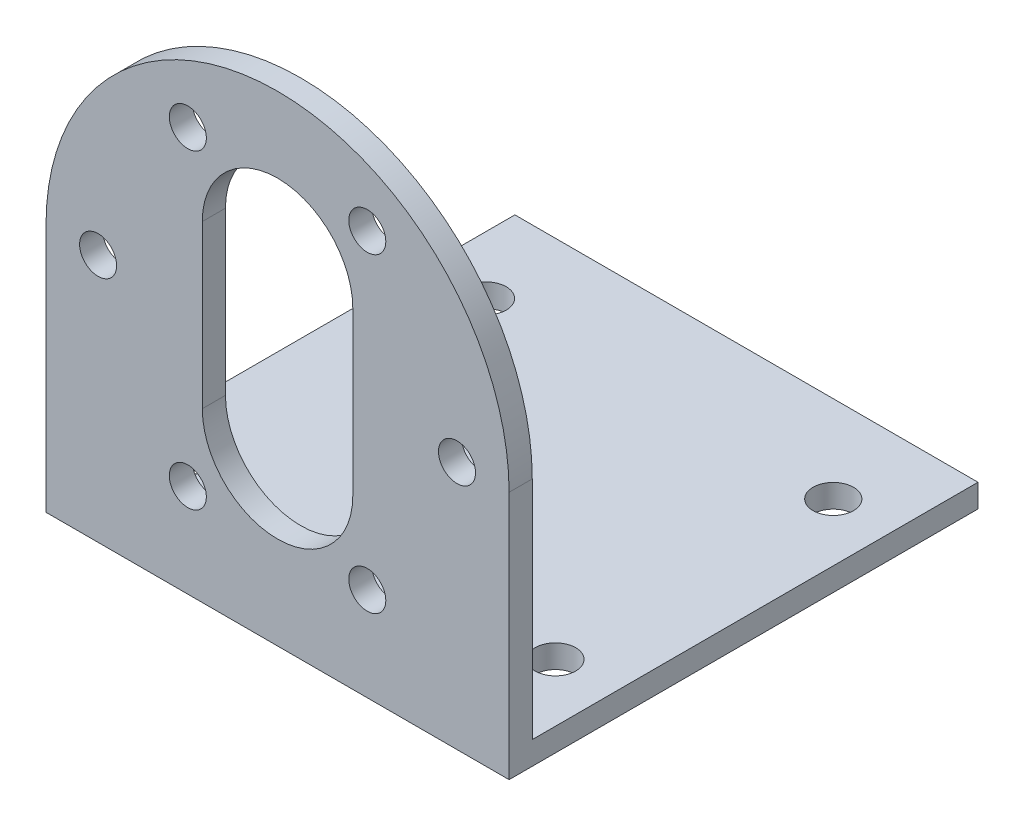
ISO-10303-21;
HEADER;
FILE_DESCRIPTION(('STEP AP214'),'2;1');
FILE_NAME('part.step','',(''),(''),'','','');
FILE_SCHEMA(('AUTOMOTIVE_DESIGN { 1 0 10303 214 1 1 1 1 }'));
ENDSEC;
DATA;
#1=APPLICATION_CONTEXT('core data for automotive mechanical design processes');
#2=APPLICATION_PROTOCOL_DEFINITION('international standard','automotive_design',2000,#1);
#3=PRODUCT_CONTEXT('',#1,'mechanical');
#4=PRODUCT('Part','Part','',(#3));
#5=PRODUCT_RELATED_PRODUCT_CATEGORY('part','',(#4));
#6=PRODUCT_DEFINITION_FORMATION('','',#4);
#7=PRODUCT_DEFINITION_CONTEXT('part definition',#1,'design');
#8=PRODUCT_DEFINITION('design','',#6,#7);
#9=PRODUCT_DEFINITION_SHAPE('','',#8);
#10=(LENGTH_UNIT() NAMED_UNIT(*) SI_UNIT(.MILLI.,.METRE.));
#11=(NAMED_UNIT(*) PLANE_ANGLE_UNIT() SI_UNIT($,.RADIAN.));
#12=(NAMED_UNIT(*) SI_UNIT($,.STERADIAN.) SOLID_ANGLE_UNIT());
#13=UNCERTAINTY_MEASURE_WITH_UNIT(LENGTH_MEASURE(1.E-05),#10,'distance_accuracy_value','');
#14=(GEOMETRIC_REPRESENTATION_CONTEXT(3) GLOBAL_UNCERTAINTY_ASSIGNED_CONTEXT((#13)) GLOBAL_UNIT_ASSIGNED_CONTEXT((#10,
#11,#12)) REPRESENTATION_CONTEXT('',''));
#15=CARTESIAN_POINT('',(0.,0.,0.));
#16=DIRECTION('',(0.,0.,1.));
#17=DIRECTION('',(1.,0.,0.));
#18=AXIS2_PLACEMENT_3D('',#15,#16,#17);
#19=CARTESIAN_POINT('',(0.,19.5,-20.25));
#20=DIRECTION('',(0.,0.,1.));
#21=DIRECTION('',(1.,0.,0.));
#22=AXIS2_PLACEMENT_3D('',#19,#20,#21);
#23=CYLINDRICAL_SURFACE('',#22,20.);
#24=DIRECTION('',(0.,0.,1.));
#25=VECTOR('',#24,1.);
#26=CARTESIAN_POINT('',(20.,19.5,-20.25));
#27=LINE('',#26,#25);
#28=CARTESIAN_POINT('',(20.,19.5,18.25));
#29=VERTEX_POINT('',#28);
#30=CARTESIAN_POINT('',(20.,19.5,20.25));
#31=VERTEX_POINT('',#30);
#32=EDGE_CURVE('E108',#29,#31,#27,.T.);
#33=ORIENTED_EDGE('',*,*,#32,.F.);
#34=CARTESIAN_POINT('',(0.,19.5,18.25));
#35=DIRECTION('',(0.,0.,-1.));
#36=DIRECTION('',(-1.,0.,0.));
#37=AXIS2_PLACEMENT_3D('',#34,#35,#36);
#38=CIRCLE('',#37,20.);
#39=CARTESIAN_POINT('',(-20.,19.5,18.25));
#40=VERTEX_POINT('',#39);
#41=EDGE_CURVE('E218',#40,#29,#38,.T.);
#42=ORIENTED_EDGE('',*,*,#41,.F.);
#43=DIRECTION('',(0.,0.,1.));
#44=VECTOR('',#43,1.);
#45=CARTESIAN_POINT('',(-20.,19.5,-20.25));
#46=LINE('',#45,#44);
#47=CARTESIAN_POINT('',(-20.,19.5,20.25));
#48=VERTEX_POINT('',#47);
#49=EDGE_CURVE('E85',#40,#48,#46,.T.);
#50=ORIENTED_EDGE('',*,*,#49,.T.);
#51=CARTESIAN_POINT('',(0.,19.5,20.25));
#52=DIRECTION('',(0.,0.,1.));
#53=DIRECTION('',(1.,0.,0.));
#54=AXIS2_PLACEMENT_3D('',#51,#52,#53);
#55=CIRCLE('',#54,20.);
#56=EDGE_CURVE('E99',#31,#48,#55,.T.);
#57=ORIENTED_EDGE('',*,*,#56,.F.);
#58=EDGE_LOOP('',(#33,#42,#50,#57));
#59=FACE_BOUND('',#58,.T.);
#60=ADVANCED_FACE('F34',(#59),#23,.T.);
#61=CARTESIAN_POINT('',(7.74999999999999,32.9233937586588,20.25));
#62=DIRECTION('',(0.,0.,1.));
#63=DIRECTION('',(1.,0.,0.));
#64=AXIS2_PLACEMENT_3D('',#61,#62,#63);
#65=CYLINDRICAL_SURFACE('',#64,1.59999999999999);
#66=CARTESIAN_POINT('',(7.74999999999999,32.9233937586588,20.25));
#67=DIRECTION('',(0.,0.,1.));
#68=DIRECTION('',(1.,0.,0.));
#69=AXIS2_PLACEMENT_3D('',#66,#67,#68);
#70=CIRCLE('',#69,1.59999999999999);
#71=CARTESIAN_POINT('',(9.34999999999998,32.9233937586588,20.25));
#72=VERTEX_POINT('',#71);
#73=EDGE_CURVE('E120',#72,#72,#70,.T.);
#74=ORIENTED_EDGE('',*,*,#73,.T.);
#75=EDGE_LOOP('',(#74));
#76=FACE_BOUND('',#75,.T.);
#77=CARTESIAN_POINT('',(7.74999999999999,32.9233937586588,18.25));
#78=DIRECTION('',(0.,0.,-1.));
#79=DIRECTION('',(-1.,0.,0.));
#80=AXIS2_PLACEMENT_3D('',#77,#78,#79);
#81=CIRCLE('',#80,1.59999999999998);
#82=CARTESIAN_POINT('',(6.15000000000001,32.9233937586588,18.25));
#83=VERTEX_POINT('',#82);
#84=EDGE_CURVE('E443',#83,#83,#81,.T.);
#85=ORIENTED_EDGE('',*,*,#84,.T.);
#86=EDGE_LOOP('',(#85));
#87=FACE_BOUND('',#86,.T.);
#88=ADVANCED_FACE('F264',(#76,#87),#65,.F.);
#89=CARTESIAN_POINT('',(-15.5,19.5,20.25));
#90=DIRECTION('',(0.,0.,1.));
#91=DIRECTION('',(1.,0.,0.));
#92=AXIS2_PLACEMENT_3D('',#89,#90,#91);
#93=CYLINDRICAL_SURFACE('',#92,1.59999999999999);
#94=CARTESIAN_POINT('',(-15.5,19.5,20.25));
#95=DIRECTION('',(0.,0.,1.));
#96=DIRECTION('',(1.,0.,0.));
#97=AXIS2_PLACEMENT_3D('',#94,#95,#96);
#98=CIRCLE('',#97,1.59999999999999);
#99=CARTESIAN_POINT('',(-13.9,19.5,20.25));
#100=VERTEX_POINT('',#99);
#101=EDGE_CURVE('E115',#100,#100,#98,.T.);
#102=ORIENTED_EDGE('',*,*,#101,.T.);
#103=EDGE_LOOP('',(#102));
#104=FACE_BOUND('',#103,.T.);
#105=CARTESIAN_POINT('',(-15.5,19.5,18.25));
#106=DIRECTION('',(0.,0.,1.));
#107=DIRECTION('',(0.,-1.,0.));
#108=AXIS2_PLACEMENT_3D('',#105,#106,#107);
#109=CIRCLE('',#108,1.59999999999999);
#110=CARTESIAN_POINT('',(-15.5,17.9,18.25));
#111=VERTEX_POINT('',#110);
#112=EDGE_CURVE('E43',#111,#111,#109,.T.);
#113=ORIENTED_EDGE('',*,*,#112,.F.);
#114=EDGE_LOOP('',(#113));
#115=FACE_BOUND('',#114,.T.);
#116=ADVANCED_FACE('F269',(#104,#115),#93,.F.);
#117=CARTESIAN_POINT('',(15.5,19.5,20.25));
#118=DIRECTION('',(0.,0.,1.));
#119=DIRECTION('',(1.,0.,0.));
#120=AXIS2_PLACEMENT_3D('',#117,#118,#119);
#121=CYLINDRICAL_SURFACE('',#120,1.59999999999999);
#122=CARTESIAN_POINT('',(15.5,19.5,20.25));
#123=DIRECTION('',(0.,0.,1.));
#124=DIRECTION('',(1.,0.,0.));
#125=AXIS2_PLACEMENT_3D('',#122,#123,#124);
#126=CIRCLE('',#125,1.59999999999999);
#127=CARTESIAN_POINT('',(17.1,19.5,20.25));
#128=VERTEX_POINT('',#127);
#129=EDGE_CURVE('E123',#128,#128,#126,.T.);
#130=ORIENTED_EDGE('',*,*,#129,.T.);
#131=EDGE_LOOP('',(#130));
#132=FACE_BOUND('',#131,.T.);
#133=CARTESIAN_POINT('',(15.5,19.5,18.25));
#134=DIRECTION('',(0.,0.,1.));
#135=DIRECTION('',(0.,-1.,0.));
#136=AXIS2_PLACEMENT_3D('',#133,#134,#135);
#137=CIRCLE('',#136,1.59999999999999);
#138=CARTESIAN_POINT('',(15.5,17.9,18.25));
#139=VERTEX_POINT('',#138);
#140=EDGE_CURVE('E11',#139,#139,#137,.T.);
#141=ORIENTED_EDGE('',*,*,#140,.F.);
#142=EDGE_LOOP('',(#141));
#143=FACE_BOUND('',#142,.T.);
#144=ADVANCED_FACE('F258',(#132,#143),#121,.F.);
#145=CARTESIAN_POINT('',(-7.75000000000001,32.9233937586588,20.25));
#146=DIRECTION('',(0.,0.,1.));
#147=DIRECTION('',(1.,0.,0.));
#148=AXIS2_PLACEMENT_3D('',#145,#146,#147);
#149=CYLINDRICAL_SURFACE('',#148,1.59999999999998);
#150=CARTESIAN_POINT('',(-7.75000000000001,32.9233937586588,20.25));
#151=DIRECTION('',(0.,0.,1.));
#152=DIRECTION('',(1.,0.,0.));
#153=AXIS2_PLACEMENT_3D('',#150,#151,#152);
#154=CIRCLE('',#153,1.59999999999999);
#155=CARTESIAN_POINT('',(-6.15000000000002,32.9233937586588,20.25));
#156=VERTEX_POINT('',#155);
#157=EDGE_CURVE('E449',#156,#156,#154,.T.);
#158=ORIENTED_EDGE('',*,*,#157,.T.);
#159=EDGE_LOOP('',(#158));
#160=FACE_BOUND('',#159,.T.);
#161=CARTESIAN_POINT('',(-7.75000000000001,32.9233937586588,18.25));
#162=DIRECTION('',(0.,0.,-1.));
#163=DIRECTION('',(-1.,0.,0.));
#164=AXIS2_PLACEMENT_3D('',#161,#162,#163);
#165=CIRCLE('',#164,1.59999999999998);
#166=CARTESIAN_POINT('',(-9.34999999999999,32.9233937586588,18.25));
#167=VERTEX_POINT('',#166);
#168=EDGE_CURVE('E440',#167,#167,#165,.T.);
#169=ORIENTED_EDGE('',*,*,#168,.T.);
#170=EDGE_LOOP('',(#169));
#171=FACE_BOUND('',#170,.T.);
#172=ADVANCED_FACE('F251',(#160,#171),#149,.F.);
#173=CARTESIAN_POINT('',(0.,19.5,-20.25));
#174=DIRECTION('',(0.,0.,1.));
#175=DIRECTION('',(1.,0.,0.));
#176=AXIS2_PLACEMENT_3D('',#173,#174,#175);
#177=PLANE('',#176);
#178=DIRECTION('',(0.,-1.,0.));
#179=VECTOR('',#178,1.);
#180=CARTESIAN_POINT('',(-20.,19.5,-20.25));
#181=LINE('',#180,#179);
#182=CARTESIAN_POINT('',(-20.,0.,-20.25));
#183=VERTEX_POINT('',#182);
#184=CARTESIAN_POINT('',(-20.,-2.,-20.25));
#185=VERTEX_POINT('',#184);
#186=EDGE_CURVE('E59',#183,#185,#181,.T.);
#187=ORIENTED_EDGE('',*,*,#186,.F.);
#188=DIRECTION('',(1.,0.,0.));
#189=VECTOR('',#188,1.);
#190=CARTESIAN_POINT('',(-20.,0.,-20.25));
#191=LINE('',#190,#189);
#192=CARTESIAN_POINT('',(20.,0.,-20.25));
#193=VERTEX_POINT('',#192);
#194=EDGE_CURVE('E94',#183,#193,#191,.T.);
#195=ORIENTED_EDGE('',*,*,#194,.T.);
#196=DIRECTION('',(0.,1.,0.));
#197=VECTOR('',#196,1.);
#198=CARTESIAN_POINT('',(20.,-2.,-20.25));
#199=LINE('',#198,#197);
#200=CARTESIAN_POINT('',(20.,-2.,-20.25));
#201=VERTEX_POINT('',#200);
#202=EDGE_CURVE('E102',#201,#193,#199,.T.);
#203=ORIENTED_EDGE('',*,*,#202,.F.);
#204=DIRECTION('',(1.,0.,0.));
#205=VECTOR('',#204,1.);
#206=CARTESIAN_POINT('',(-20.,-2.,-20.25));
#207=LINE('',#206,#205);
#208=EDGE_CURVE('E100',#185,#201,#207,.T.);
#209=ORIENTED_EDGE('',*,*,#208,.F.);
#210=EDGE_LOOP('',(#187,#195,#203,#209));
#211=FACE_BOUND('',#210,.T.);
#212=ADVANCED_FACE('F249',(#211),#177,.F.);
#213=CARTESIAN_POINT('',(-20.,-2.,-20.25));
#214=DIRECTION('',(0.,-1.,0.));
#215=DIRECTION('',(0.,0.,-1.));
#216=AXIS2_PLACEMENT_3D('',#213,#214,#215);
#217=PLANE('',#216);
#218=CARTESIAN_POINT('',(-15.,-2.,11.25));
#219=DIRECTION('',(0.,-1.,0.));
#220=DIRECTION('',(0.,0.,-1.));
#221=AXIS2_PLACEMENT_3D('',#218,#219,#220);
#222=CIRCLE('',#221,1.74999999999998);
#223=CARTESIAN_POINT('',(-15.,-2.,9.50000000000002));
#224=VERTEX_POINT('',#223);
#225=EDGE_CURVE('E133',#224,#224,#222,.T.);
#226=ORIENTED_EDGE('',*,*,#225,.F.);
#227=EDGE_LOOP('',(#226));
#228=FACE_BOUND('',#227,.T.);
#229=CARTESIAN_POINT('',(-15.,-2.,-12.75));
#230=DIRECTION('',(0.,-1.,0.));
#231=DIRECTION('',(0.,0.,-1.));
#232=AXIS2_PLACEMENT_3D('',#229,#230,#231);
#233=CIRCLE('',#232,1.74999999999998);
#234=CARTESIAN_POINT('',(-15.,-2.,-14.5));
#235=VERTEX_POINT('',#234);
#236=EDGE_CURVE('E139',#235,#235,#233,.T.);
#237=ORIENTED_EDGE('',*,*,#236,.F.);
#238=EDGE_LOOP('',(#237));
#239=FACE_BOUND('',#238,.T.);
#240=CARTESIAN_POINT('',(15.,-2.,-12.75));
#241=DIRECTION('',(0.,-1.,0.));
#242=DIRECTION('',(0.,0.,-1.));
#243=AXIS2_PLACEMENT_3D('',#240,#241,#242);
#244=CIRCLE('',#243,1.74999999999998);
#245=CARTESIAN_POINT('',(15.,-2.,-14.5));
#246=VERTEX_POINT('',#245);
#247=EDGE_CURVE('E145',#246,#246,#244,.T.);
#248=ORIENTED_EDGE('',*,*,#247,.F.);
#249=EDGE_LOOP('',(#248));
#250=FACE_BOUND('',#249,.T.);
#251=CARTESIAN_POINT('',(15.,-2.,11.25));
#252=DIRECTION('',(0.,-1.,0.));
#253=DIRECTION('',(0.,0.,-1.));
#254=AXIS2_PLACEMENT_3D('',#251,#252,#253);
#255=CIRCLE('',#254,1.74999999999998);
#256=CARTESIAN_POINT('',(15.,-2.,9.50000000000002));
#257=VERTEX_POINT('',#256);
#258=EDGE_CURVE('E151',#257,#257,#255,.T.);
#259=ORIENTED_EDGE('',*,*,#258,.F.);
#260=EDGE_LOOP('',(#259));
#261=FACE_BOUND('',#260,.T.);
#262=DIRECTION('',(1.,0.,0.));
#263=VECTOR('',#262,1.);
#264=CARTESIAN_POINT('',(-20.,-2.,20.25));
#265=LINE('',#264,#263);
#266=CARTESIAN_POINT('',(-20.,-2.,20.25));
#267=VERTEX_POINT('',#266);
#268=CARTESIAN_POINT('',(20.,-2.,20.25));
#269=VERTEX_POINT('',#268);
#270=EDGE_CURVE('E88',#267,#269,#265,.T.);
#271=ORIENTED_EDGE('',*,*,#270,.F.);
#272=DIRECTION('',(0.,0.,1.));
#273=VECTOR('',#272,1.);
#274=CARTESIAN_POINT('',(-20.,-2.,-20.25));
#275=LINE('',#274,#273);
#276=EDGE_CURVE('E76',#185,#267,#275,.T.);
#277=ORIENTED_EDGE('',*,*,#276,.F.);
#278=ORIENTED_EDGE('',*,*,#208,.T.);
#279=DIRECTION('',(0.,0.,1.));
#280=VECTOR('',#279,1.);
#281=CARTESIAN_POINT('',(20.,-2.,-20.25));
#282=LINE('',#281,#280);
#283=EDGE_CURVE('E89',#201,#269,#282,.T.);
#284=ORIENTED_EDGE('',*,*,#283,.T.);
#285=EDGE_LOOP('',(#271,#277,#278,#284));
#286=FACE_BOUND('',#285,.T.);
#287=ADVANCED_FACE('F36',(#228,#239,#250,#261,#286),#217,.T.);
#288=CARTESIAN_POINT('',(-20.,19.5,-20.25));
#289=DIRECTION('',(-1.,0.,0.));
#290=DIRECTION('',(0.,0.,1.));
#291=AXIS2_PLACEMENT_3D('',#288,#289,#290);
#292=PLANE('',#291);
#293=DIRECTION('',(0.,0.,-1.));
#294=VECTOR('',#293,1.);
#295=CARTESIAN_POINT('',(-20.,0.,18.25));
#296=LINE('',#295,#294);
#297=CARTESIAN_POINT('',(-20.,0.,18.25));
#298=VERTEX_POINT('',#297);
#299=EDGE_CURVE('E193',#298,#183,#296,.T.);
#300=ORIENTED_EDGE('',*,*,#299,.T.);
#301=ORIENTED_EDGE('',*,*,#186,.T.);
#302=ORIENTED_EDGE('',*,*,#276,.T.);
#303=DIRECTION('',(0.,-1.,0.));
#304=VECTOR('',#303,1.);
#305=CARTESIAN_POINT('',(-20.,19.5,20.25));
#306=LINE('',#305,#304);
#307=EDGE_CURVE('E81',#48,#267,#306,.T.);
#308=ORIENTED_EDGE('',*,*,#307,.F.);
#309=ORIENTED_EDGE('',*,*,#49,.F.);
#310=DIRECTION('',(0.,-1.,0.));
#311=VECTOR('',#310,1.);
#312=CARTESIAN_POINT('',(-20.,19.5,18.25));
#313=LINE('',#312,#311);
#314=EDGE_CURVE('E190',#40,#298,#313,.T.);
#315=ORIENTED_EDGE('',*,*,#314,.T.);
#316=EDGE_LOOP('',(#300,#301,#302,#308,#309,#315));
#317=FACE_BOUND('',#316,.T.);
#318=ADVANCED_FACE('F78',(#317),#292,.T.);
#319=CARTESIAN_POINT('',(20.,-2.,-20.25));
#320=DIRECTION('',(1.,0.,0.));
#321=DIRECTION('',(0.,1.,0.));
#322=AXIS2_PLACEMENT_3D('',#319,#320,#321);
#323=PLANE('',#322);
#324=DIRECTION('',(0.,0.,-1.));
#325=VECTOR('',#324,1.);
#326=CARTESIAN_POINT('',(20.,0.,18.25));
#327=LINE('',#326,#325);
#328=CARTESIAN_POINT('',(20.,0.,18.25));
#329=VERTEX_POINT('',#328);
#330=EDGE_CURVE('E194',#329,#193,#327,.T.);
#331=ORIENTED_EDGE('',*,*,#330,.F.);
#332=DIRECTION('',(0.,-1.,0.));
#333=VECTOR('',#332,1.);
#334=CARTESIAN_POINT('',(20.,19.5,18.25));
#335=LINE('',#334,#333);
#336=EDGE_CURVE('E182',#29,#329,#335,.T.);
#337=ORIENTED_EDGE('',*,*,#336,.F.);
#338=ORIENTED_EDGE('',*,*,#32,.T.);
#339=DIRECTION('',(0.,1.,0.));
#340=VECTOR('',#339,1.);
#341=CARTESIAN_POINT('',(20.,-2.,20.25));
#342=LINE('',#341,#340);
#343=EDGE_CURVE('E93',#269,#31,#342,.T.);
#344=ORIENTED_EDGE('',*,*,#343,.F.);
#345=ORIENTED_EDGE('',*,*,#283,.F.);
#346=ORIENTED_EDGE('',*,*,#202,.T.);
#347=EDGE_LOOP('',(#331,#337,#338,#344,#345,#346));
#348=FACE_BOUND('',#347,.T.);
#349=ADVANCED_FACE('F209',(#348),#323,.T.);
#350=CARTESIAN_POINT('',(0.,19.5,20.25));
#351=DIRECTION('',(0.,0.,1.));
#352=DIRECTION('',(1.,0.,0.));
#353=AXIS2_PLACEMENT_3D('',#350,#351,#352);
#354=PLANE('',#353);
#355=ORIENTED_EDGE('',*,*,#157,.F.);
#356=EDGE_LOOP('',(#355));
#357=FACE_BOUND('',#356,.T.);
#358=CARTESIAN_POINT('',(-7.75,6.07660624134119,20.25));
#359=DIRECTION('',(0.,0.,1.));
#360=DIRECTION('',(1.,0.,0.));
#361=AXIS2_PLACEMENT_3D('',#358,#359,#360);
#362=CIRCLE('',#361,1.59999999999999);
#363=CARTESIAN_POINT('',(-6.15000000000001,6.07660624134119,20.25));
#364=VERTEX_POINT('',#363);
#365=EDGE_CURVE('E451',#364,#364,#362,.T.);
#366=ORIENTED_EDGE('',*,*,#365,.F.);
#367=EDGE_LOOP('',(#366));
#368=FACE_BOUND('',#367,.T.);
#369=ORIENTED_EDGE('',*,*,#129,.F.);
#370=EDGE_LOOP('',(#369));
#371=FACE_BOUND('',#370,.T.);
#372=CARTESIAN_POINT('',(7.75,6.0766062413412,20.25));
#373=DIRECTION('',(0.,0.,1.));
#374=DIRECTION('',(1.,0.,0.));
#375=AXIS2_PLACEMENT_3D('',#372,#373,#374);
#376=CIRCLE('',#375,1.59999999999999);
#377=CARTESIAN_POINT('',(9.34999999999999,6.0766062413412,20.25));
#378=VERTEX_POINT('',#377);
#379=EDGE_CURVE('E116',#378,#378,#376,.T.);
#380=ORIENTED_EDGE('',*,*,#379,.F.);
#381=EDGE_LOOP('',(#380));
#382=FACE_BOUND('',#381,.T.);
#383=ORIENTED_EDGE('',*,*,#101,.F.);
#384=EDGE_LOOP('',(#383));
#385=FACE_BOUND('',#384,.T.);
#386=ORIENTED_EDGE('',*,*,#73,.F.);
#387=EDGE_LOOP('',(#386));
#388=FACE_BOUND('',#387,.T.);
#389=CARTESIAN_POINT('',(0.,26.5,20.25));
#390=DIRECTION('',(0.,0.,1.));
#391=DIRECTION('',(1.,0.,0.));
#392=AXIS2_PLACEMENT_3D('',#389,#390,#391);
#393=CIRCLE('',#392,6.5);
#394=CARTESIAN_POINT('',(6.49999999999999,26.5,20.25));
#395=VERTEX_POINT('',#394);
#396=CARTESIAN_POINT('',(-6.50000000000001,26.5,20.25));
#397=VERTEX_POINT('',#396);
#398=EDGE_CURVE('E50',#395,#397,#393,.T.);
#399=ORIENTED_EDGE('',*,*,#398,.F.);
#400=DIRECTION('',(0.,1.,0.));
#401=VECTOR('',#400,1.);
#402=CARTESIAN_POINT('',(6.5,12.5,20.25));
#403=LINE('',#402,#401);
#404=CARTESIAN_POINT('',(6.5,12.5,20.25));
#405=VERTEX_POINT('',#404);
#406=EDGE_CURVE('E161',#405,#395,#403,.T.);
#407=ORIENTED_EDGE('',*,*,#406,.F.);
#408=CARTESIAN_POINT('',(0.,12.5,20.25));
#409=DIRECTION('',(0.,0.,1.));
#410=DIRECTION('',(1.,0.,0.));
#411=AXIS2_PLACEMENT_3D('',#408,#409,#410);
#412=CIRCLE('',#411,6.5);
#413=CARTESIAN_POINT('',(-6.5,12.5,20.25));
#414=VERTEX_POINT('',#413);
#415=EDGE_CURVE('E175',#414,#405,#412,.T.);
#416=ORIENTED_EDGE('',*,*,#415,.F.);
#417=DIRECTION('',(0.,-1.,0.));
#418=VECTOR('',#417,1.);
#419=CARTESIAN_POINT('',(-6.50000000000001,26.5,20.25));
#420=LINE('',#419,#418);
#421=EDGE_CURVE('E172',#397,#414,#420,.T.);
#422=ORIENTED_EDGE('',*,*,#421,.F.);
#423=EDGE_LOOP('',(#399,#407,#416,#422));
#424=FACE_BOUND('',#423,.T.);
#425=ORIENTED_EDGE('',*,*,#270,.T.);
#426=ORIENTED_EDGE('',*,*,#343,.T.);
#427=ORIENTED_EDGE('',*,*,#56,.T.);
#428=ORIENTED_EDGE('',*,*,#307,.T.);
#429=EDGE_LOOP('',(#425,#426,#427,#428));
#430=FACE_BOUND('',#429,.T.);
#431=ADVANCED_FACE('F97',(#357,#368,#371,#382,#385,#388,#424,#430),#354,.T.);
#432=CARTESIAN_POINT('',(-20.,0.,18.25));
#433=DIRECTION('',(0.,-1.,0.));
#434=DIRECTION('',(1.,0.,0.));
#435=AXIS2_PLACEMENT_3D('',#432,#433,#434);
#436=PLANE('',#435);
#437=CARTESIAN_POINT('',(-15.,0.,11.25));
#438=DIRECTION('',(0.,-1.,0.));
#439=DIRECTION('',(1.,0.,0.));
#440=AXIS2_PLACEMENT_3D('',#437,#438,#439);
#441=CIRCLE('',#440,1.74999999999999);
#442=CARTESIAN_POINT('',(-13.25,0.,11.25));
#443=VERTEX_POINT('',#442);
#444=EDGE_CURVE('E136',#443,#443,#441,.T.);
#445=ORIENTED_EDGE('',*,*,#444,.T.);
#446=EDGE_LOOP('',(#445));
#447=FACE_BOUND('',#446,.T.);
#448=CARTESIAN_POINT('',(-15.,0.,-12.75));
#449=DIRECTION('',(0.,-1.,0.));
#450=DIRECTION('',(1.,0.,0.));
#451=AXIS2_PLACEMENT_3D('',#448,#449,#450);
#452=CIRCLE('',#451,1.74999999999999);
#453=CARTESIAN_POINT('',(-13.25,0.,-12.75));
#454=VERTEX_POINT('',#453);
#455=EDGE_CURVE('E142',#454,#454,#452,.T.);
#456=ORIENTED_EDGE('',*,*,#455,.T.);
#457=EDGE_LOOP('',(#456));
#458=FACE_BOUND('',#457,.T.);
#459=CARTESIAN_POINT('',(15.,0.,-12.75));
#460=DIRECTION('',(0.,-1.,0.));
#461=DIRECTION('',(1.,0.,0.));
#462=AXIS2_PLACEMENT_3D('',#459,#460,#461);
#463=CIRCLE('',#462,1.74999999999999);
#464=CARTESIAN_POINT('',(16.75,0.,-12.75));
#465=VERTEX_POINT('',#464);
#466=EDGE_CURVE('E148',#465,#465,#463,.T.);
#467=ORIENTED_EDGE('',*,*,#466,.T.);
#468=EDGE_LOOP('',(#467));
#469=FACE_BOUND('',#468,.T.);
#470=CARTESIAN_POINT('',(15.,0.,11.25));
#471=DIRECTION('',(0.,-1.,0.));
#472=DIRECTION('',(1.,0.,0.));
#473=AXIS2_PLACEMENT_3D('',#470,#471,#472);
#474=CIRCLE('',#473,1.74999999999999);
#475=CARTESIAN_POINT('',(16.75,0.,11.25));
#476=VERTEX_POINT('',#475);
#477=EDGE_CURVE('E154',#476,#476,#474,.T.);
#478=ORIENTED_EDGE('',*,*,#477,.T.);
#479=EDGE_LOOP('',(#478));
#480=FACE_BOUND('',#479,.T.);
#481=ORIENTED_EDGE('',*,*,#330,.T.);
#482=ORIENTED_EDGE('',*,*,#194,.F.);
#483=ORIENTED_EDGE('',*,*,#299,.F.);
#484=DIRECTION('',(1.,0.,0.));
#485=VECTOR('',#484,1.);
#486=CARTESIAN_POINT('',(-20.,0.,18.25));
#487=LINE('',#486,#485);
#488=EDGE_CURVE('E196',#298,#329,#487,.T.);
#489=ORIENTED_EDGE('',*,*,#488,.T.);
#490=EDGE_LOOP('',(#481,#482,#483,#489));
#491=FACE_BOUND('',#490,.T.);
#492=ADVANCED_FACE('F246',(#447,#458,#469,#480,#491),#436,.F.);
#493=CARTESIAN_POINT('',(-20.,19.5,18.25));
#494=DIRECTION('',(0.,0.,1.));
#495=DIRECTION('',(0.,-1.,0.));
#496=AXIS2_PLACEMENT_3D('',#493,#494,#495);
#497=PLANE('',#496);
#498=ORIENTED_EDGE('',*,*,#112,.T.);
#499=EDGE_LOOP('',(#498));
#500=FACE_BOUND('',#499,.T.);
#501=DIRECTION('',(0.,-1.,0.));
#502=VECTOR('',#501,1.);
#503=CARTESIAN_POINT('',(-6.50000000000001,26.5,18.25));
#504=LINE('',#503,#502);
#505=CARTESIAN_POINT('',(-6.50000000000001,26.5,18.25));
#506=VERTEX_POINT('',#505);
#507=CARTESIAN_POINT('',(-6.5,12.5,18.25));
#508=VERTEX_POINT('',#507);
#509=EDGE_CURVE('E160',#506,#508,#504,.T.);
#510=ORIENTED_EDGE('',*,*,#509,.T.);
#511=CARTESIAN_POINT('',(0.,12.5,18.25));
#512=DIRECTION('',(0.,0.,1.));
#513=DIRECTION('',(1.,0.,0.));
#514=AXIS2_PLACEMENT_3D('',#511,#512,#513);
#515=CIRCLE('',#514,6.5);
#516=CARTESIAN_POINT('',(6.5,12.5,18.25));
#517=VERTEX_POINT('',#516);
#518=EDGE_CURVE('E164',#508,#517,#515,.T.);
#519=ORIENTED_EDGE('',*,*,#518,.T.);
#520=DIRECTION('',(0.,1.,0.));
#521=VECTOR('',#520,1.);
#522=CARTESIAN_POINT('',(6.5,12.5,18.25));
#523=LINE('',#522,#521);
#524=CARTESIAN_POINT('',(6.49999999999999,26.5,18.25));
#525=VERTEX_POINT('',#524);
#526=EDGE_CURVE('E167',#517,#525,#523,.T.);
#527=ORIENTED_EDGE('',*,*,#526,.T.);
#528=CARTESIAN_POINT('',(0.,26.5,18.25));
#529=DIRECTION('',(0.,0.,1.));
#530=DIRECTION('',(1.,0.,0.));
#531=AXIS2_PLACEMENT_3D('',#528,#529,#530);
#532=CIRCLE('',#531,6.5);
#533=EDGE_CURVE('E157',#525,#506,#532,.T.);
#534=ORIENTED_EDGE('',*,*,#533,.T.);
#535=EDGE_LOOP('',(#510,#519,#527,#534));
#536=FACE_BOUND('',#535,.T.);
#537=ORIENTED_EDGE('',*,*,#140,.T.);
#538=EDGE_LOOP('',(#537));
#539=FACE_BOUND('',#538,.T.);
#540=CARTESIAN_POINT('',(-7.75,6.07660624134119,18.25));
#541=DIRECTION('',(0.,0.,1.));
#542=DIRECTION('',(0.,-1.,0.));
#543=AXIS2_PLACEMENT_3D('',#540,#541,#542);
#544=CIRCLE('',#543,1.59999999999998);
#545=CARTESIAN_POINT('',(-7.75,4.47660624134121,18.25));
#546=VERTEX_POINT('',#545);
#547=EDGE_CURVE('E38',#546,#546,#544,.T.);
#548=ORIENTED_EDGE('',*,*,#547,.T.);
#549=EDGE_LOOP('',(#548));
#550=FACE_BOUND('',#549,.T.);
#551=CARTESIAN_POINT('',(7.75,6.0766062413412,18.25));
#552=DIRECTION('',(0.,0.,1.));
#553=DIRECTION('',(0.,-1.,0.));
#554=AXIS2_PLACEMENT_3D('',#551,#552,#553);
#555=CIRCLE('',#554,1.59999999999999);
#556=CARTESIAN_POINT('',(7.75,4.47660624134121,18.25));
#557=VERTEX_POINT('',#556);
#558=EDGE_CURVE('E113',#557,#557,#555,.T.);
#559=ORIENTED_EDGE('',*,*,#558,.T.);
#560=EDGE_LOOP('',(#559));
#561=FACE_BOUND('',#560,.T.);
#562=ORIENTED_EDGE('',*,*,#314,.F.);
#563=ORIENTED_EDGE('',*,*,#41,.T.);
#564=ORIENTED_EDGE('',*,*,#336,.T.);
#565=ORIENTED_EDGE('',*,*,#488,.F.);
#566=EDGE_LOOP('',(#562,#563,#564,#565));
#567=FACE_BOUND('',#566,.T.);
#568=ORIENTED_EDGE('',*,*,#168,.F.);
#569=EDGE_LOOP('',(#568));
#570=FACE_BOUND('',#569,.T.);
#571=ORIENTED_EDGE('',*,*,#84,.F.);
#572=EDGE_LOOP('',(#571));
#573=FACE_BOUND('',#572,.T.);
#574=ADVANCED_FACE('F300',(#500,#536,#539,#550,#561,#567,#570,#573),#497,.F.);
#575=CARTESIAN_POINT('',(0.,26.5,18.25));
#576=DIRECTION('',(0.,0.,1.));
#577=DIRECTION('',(1.,0.,0.));
#578=AXIS2_PLACEMENT_3D('',#575,#576,#577);
#579=CYLINDRICAL_SURFACE('',#578,6.5);
#580=ORIENTED_EDGE('',*,*,#398,.T.);
#581=DIRECTION('',(0.,0.,1.));
#582=VECTOR('',#581,1.);
#583=CARTESIAN_POINT('',(-6.50000000000001,26.5,18.25));
#584=LINE('',#583,#582);
#585=EDGE_CURVE('E170',#506,#397,#584,.T.);
#586=ORIENTED_EDGE('',*,*,#585,.F.);
#587=ORIENTED_EDGE('',*,*,#533,.F.);
#588=DIRECTION('',(0.,0.,1.));
#589=VECTOR('',#588,1.);
#590=CARTESIAN_POINT('',(6.49999999999999,26.5,18.25));
#591=LINE('',#590,#589);
#592=EDGE_CURVE('E180',#525,#395,#591,.T.);
#593=ORIENTED_EDGE('',*,*,#592,.T.);
#594=EDGE_LOOP('',(#580,#586,#587,#593));
#595=FACE_BOUND('',#594,.T.);
#596=ADVANCED_FACE('F416',(#595),#579,.F.);
#597=CARTESIAN_POINT('',(6.5,12.5,18.25));
#598=DIRECTION('',(1.,0.,0.));
#599=DIRECTION('',(0.,1.,0.));
#600=AXIS2_PLACEMENT_3D('',#597,#598,#599);
#601=PLANE('',#600);
#602=ORIENTED_EDGE('',*,*,#406,.T.);
#603=ORIENTED_EDGE('',*,*,#592,.F.);
#604=ORIENTED_EDGE('',*,*,#526,.F.);
#605=DIRECTION('',(0.,0.,1.));
#606=VECTOR('',#605,1.);
#607=CARTESIAN_POINT('',(6.5,12.5,18.25));
#608=LINE('',#607,#606);
#609=EDGE_CURVE('E183',#517,#405,#608,.T.);
#610=ORIENTED_EDGE('',*,*,#609,.T.);
#611=EDGE_LOOP('',(#602,#603,#604,#610));
#612=FACE_BOUND('',#611,.T.);
#613=ADVANCED_FACE('F413',(#612),#601,.F.);
#614=CARTESIAN_POINT('',(0.,12.5,18.25));
#615=DIRECTION('',(0.,0.,1.));
#616=DIRECTION('',(1.,0.,0.));
#617=AXIS2_PLACEMENT_3D('',#614,#615,#616);
#618=CYLINDRICAL_SURFACE('',#617,6.5);
#619=ORIENTED_EDGE('',*,*,#415,.T.);
#620=ORIENTED_EDGE('',*,*,#609,.F.);
#621=ORIENTED_EDGE('',*,*,#518,.F.);
#622=DIRECTION('',(0.,0.,1.));
#623=VECTOR('',#622,1.);
#624=CARTESIAN_POINT('',(-6.5,12.5,18.25));
#625=LINE('',#624,#623);
#626=EDGE_CURVE('E186',#508,#414,#625,.T.);
#627=ORIENTED_EDGE('',*,*,#626,.T.);
#628=EDGE_LOOP('',(#619,#620,#621,#627));
#629=FACE_BOUND('',#628,.T.);
#630=ADVANCED_FACE('F292',(#629),#618,.F.);
#631=CARTESIAN_POINT('',(-6.50000000000001,26.5,18.25));
#632=DIRECTION('',(-1.,0.,0.));
#633=DIRECTION('',(0.,-1.,0.));
#634=AXIS2_PLACEMENT_3D('',#631,#632,#633);
#635=PLANE('',#634);
#636=ORIENTED_EDGE('',*,*,#421,.T.);
#637=ORIENTED_EDGE('',*,*,#626,.F.);
#638=ORIENTED_EDGE('',*,*,#509,.F.);
#639=ORIENTED_EDGE('',*,*,#585,.T.);
#640=EDGE_LOOP('',(#636,#637,#638,#639));
#641=FACE_BOUND('',#640,.T.);
#642=ADVANCED_FACE('F315',(#641),#635,.F.);
#643=CARTESIAN_POINT('',(15.,-2.,11.25));
#644=DIRECTION('',(0.,-1.,0.));
#645=DIRECTION('',(0.,0.,-1.));
#646=AXIS2_PLACEMENT_3D('',#643,#644,#645);
#647=CYLINDRICAL_SURFACE('',#646,1.74999999999999);
#648=ORIENTED_EDGE('',*,*,#477,.F.);
#649=EDGE_LOOP('',(#648));
#650=FACE_BOUND('',#649,.T.);
#651=ORIENTED_EDGE('',*,*,#258,.T.);
#652=EDGE_LOOP('',(#651));
#653=FACE_BOUND('',#652,.T.);
#654=ADVANCED_FACE('F309',(#650,#653),#647,.F.);
#655=CARTESIAN_POINT('',(15.,-2.,-12.75));
#656=DIRECTION('',(0.,-1.,0.));
#657=DIRECTION('',(0.,0.,-1.));
#658=AXIS2_PLACEMENT_3D('',#655,#656,#657);
#659=CYLINDRICAL_SURFACE('',#658,1.74999999999999);
#660=ORIENTED_EDGE('',*,*,#466,.F.);
#661=EDGE_LOOP('',(#660));
#662=FACE_BOUND('',#661,.T.);
#663=ORIENTED_EDGE('',*,*,#247,.T.);
#664=EDGE_LOOP('',(#663));
#665=FACE_BOUND('',#664,.T.);
#666=ADVANCED_FACE('F314',(#662,#665),#659,.F.);
#667=CARTESIAN_POINT('',(-15.,-2.,-12.75));
#668=DIRECTION('',(0.,-1.,0.));
#669=DIRECTION('',(0.,0.,-1.));
#670=AXIS2_PLACEMENT_3D('',#667,#668,#669);
#671=CYLINDRICAL_SURFACE('',#670,1.74999999999999);
#672=ORIENTED_EDGE('',*,*,#455,.F.);
#673=EDGE_LOOP('',(#672));
#674=FACE_BOUND('',#673,.T.);
#675=ORIENTED_EDGE('',*,*,#236,.T.);
#676=EDGE_LOOP('',(#675));
#677=FACE_BOUND('',#676,.T.);
#678=ADVANCED_FACE('F327',(#674,#677),#671,.F.);
#679=CARTESIAN_POINT('',(-15.,-2.,11.25));
#680=DIRECTION('',(0.,-1.,0.));
#681=DIRECTION('',(0.,0.,-1.));
#682=AXIS2_PLACEMENT_3D('',#679,#680,#681);
#683=CYLINDRICAL_SURFACE('',#682,1.74999999999999);
#684=ORIENTED_EDGE('',*,*,#444,.F.);
#685=EDGE_LOOP('',(#684));
#686=FACE_BOUND('',#685,.T.);
#687=ORIENTED_EDGE('',*,*,#225,.T.);
#688=EDGE_LOOP('',(#687));
#689=FACE_BOUND('',#688,.T.);
#690=ADVANCED_FACE('F337',(#686,#689),#683,.F.);
#691=CARTESIAN_POINT('',(7.75,6.0766062413412,20.25));
#692=DIRECTION('',(0.,0.,1.));
#693=DIRECTION('',(1.,0.,0.));
#694=AXIS2_PLACEMENT_3D('',#691,#692,#693);
#695=CYLINDRICAL_SURFACE('',#694,1.59999999999999);
#696=ORIENTED_EDGE('',*,*,#379,.T.);
#697=EDGE_LOOP('',(#696));
#698=FACE_BOUND('',#697,.T.);
#699=ORIENTED_EDGE('',*,*,#558,.F.);
#700=EDGE_LOOP('',(#699));
#701=FACE_BOUND('',#700,.T.);
#702=ADVANCED_FACE('F347',(#698,#701),#695,.F.);
#703=CARTESIAN_POINT('',(-7.75,6.07660624134119,20.25));
#704=DIRECTION('',(0.,0.,1.));
#705=DIRECTION('',(1.,0.,0.));
#706=AXIS2_PLACEMENT_3D('',#703,#704,#705);
#707=CYLINDRICAL_SURFACE('',#706,1.59999999999998);
#708=ORIENTED_EDGE('',*,*,#365,.T.);
#709=EDGE_LOOP('',(#708));
#710=FACE_BOUND('',#709,.T.);
#711=ORIENTED_EDGE('',*,*,#547,.F.);
#712=EDGE_LOOP('',(#711));
#713=FACE_BOUND('',#712,.T.);
#714=ADVANCED_FACE('F364',(#710,#713),#707,.F.);
#715=CLOSED_SHELL('',(#60,#88,#116,#144,#172,#212,#287,#318,#349,#431,#492,#574,#596,#613,#630,
#642,#654,#666,#678,#690,#702,#714));
#716=MANIFOLD_SOLID_BREP('B2',#715);
#717=ADVANCED_BREP_SHAPE_REPRESENTATION('',(#18,#716),#14);
#718=SHAPE_DEFINITION_REPRESENTATION(#9,#717);
ENDSEC;
END-ISO-10303-21;
